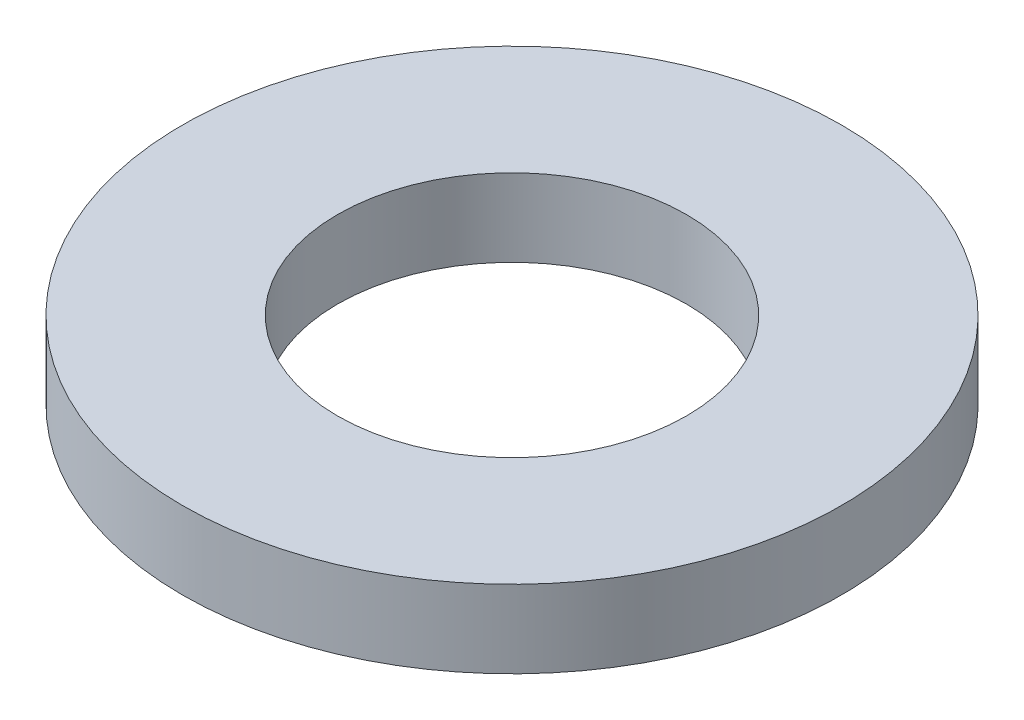
ISO-10303-21;
HEADER;
FILE_DESCRIPTION(('STEP AP214'),'2;1');
FILE_NAME('part.step','',(''),(''),'','','');
FILE_SCHEMA(('AUTOMOTIVE_DESIGN { 1 0 10303 214 1 1 1 1 }'));
ENDSEC;
DATA;
#1=APPLICATION_CONTEXT('core data for automotive mechanical design processes');
#2=APPLICATION_PROTOCOL_DEFINITION('international standard','automotive_design',2000,#1);
#3=PRODUCT_CONTEXT('',#1,'mechanical');
#4=PRODUCT('Part','Part','',(#3));
#5=PRODUCT_RELATED_PRODUCT_CATEGORY('part','',(#4));
#6=PRODUCT_DEFINITION_FORMATION('','',#4);
#7=PRODUCT_DEFINITION_CONTEXT('part definition',#1,'design');
#8=PRODUCT_DEFINITION('design','',#6,#7);
#9=PRODUCT_DEFINITION_SHAPE('','',#8);
#10=(LENGTH_UNIT() NAMED_UNIT(*) SI_UNIT(.MILLI.,.METRE.));
#11=(NAMED_UNIT(*) PLANE_ANGLE_UNIT() SI_UNIT($,.RADIAN.));
#12=(NAMED_UNIT(*) SI_UNIT($,.STERADIAN.) SOLID_ANGLE_UNIT());
#13=UNCERTAINTY_MEASURE_WITH_UNIT(LENGTH_MEASURE(1.E-05),#10,'distance_accuracy_value','');
#14=(GEOMETRIC_REPRESENTATION_CONTEXT(3) GLOBAL_UNCERTAINTY_ASSIGNED_CONTEXT((#13)) GLOBAL_UNIT_ASSIGNED_CONTEXT((#10,
#11,#12)) REPRESENTATION_CONTEXT('',''));
#15=CARTESIAN_POINT('',(0.,0.,0.));
#16=DIRECTION('',(0.,0.,1.));
#17=DIRECTION('',(1.,0.,0.));
#18=AXIS2_PLACEMENT_3D('',#15,#16,#17);
#19=CARTESIAN_POINT('',(0.,12.7,0.));
#20=DIRECTION('',(0.,1.,0.));
#21=DIRECTION('',(0.,0.,1.));
#22=AXIS2_PLACEMENT_3D('',#19,#20,#21);
#23=PLANE('',#22);
#24=CARTESIAN_POINT('',(0.,12.7,0.));
#25=DIRECTION('',(0.,1.,0.));
#26=DIRECTION('',(0.,0.,1.));
#27=AXIS2_PLACEMENT_3D('',#24,#25,#26);
#28=CIRCLE('',#27,53.975);
#29=CARTESIAN_POINT('',(0.,12.7,53.975));
#30=VERTEX_POINT('',#29);
#31=EDGE_CURVE('E10',#30,#30,#28,.T.);
#32=ORIENTED_EDGE('',*,*,#31,.T.);
#33=EDGE_LOOP('',(#32));
#34=FACE_BOUND('',#33,.T.);
#35=CARTESIAN_POINT('',(0.,12.7,0.));
#36=DIRECTION('',(0.,1.,0.));
#37=DIRECTION('',(0.,0.,1.));
#38=AXIS2_PLACEMENT_3D('',#35,#36,#37);
#39=CIRCLE('',#38,28.575);
#40=CARTESIAN_POINT('',(0.,12.7,28.575));
#41=VERTEX_POINT('',#40);
#42=EDGE_CURVE('E43',#41,#41,#39,.T.);
#43=ORIENTED_EDGE('',*,*,#42,.F.);
#44=EDGE_LOOP('',(#43));
#45=FACE_BOUND('',#44,.T.);
#46=ADVANCED_FACE('F32',(#34,#45),#23,.T.);
#47=CARTESIAN_POINT('',(0.,0.,0.));
#48=DIRECTION('',(0.,1.,0.));
#49=DIRECTION('',(0.,0.,1.));
#50=AXIS2_PLACEMENT_3D('',#47,#48,#49);
#51=PLANE('',#50);
#52=CARTESIAN_POINT('',(0.,0.,0.));
#53=DIRECTION('',(0.,1.,0.));
#54=DIRECTION('',(0.,0.,1.));
#55=AXIS2_PLACEMENT_3D('',#52,#53,#54);
#56=CIRCLE('',#55,53.975);
#57=CARTESIAN_POINT('',(0.,0.,53.975));
#58=VERTEX_POINT('',#57);
#59=EDGE_CURVE('E36',#58,#58,#56,.T.);
#60=ORIENTED_EDGE('',*,*,#59,.F.);
#61=EDGE_LOOP('',(#60));
#62=FACE_BOUND('',#61,.T.);
#63=CARTESIAN_POINT('',(0.,0.,0.));
#64=DIRECTION('',(0.,1.,0.));
#65=DIRECTION('',(0.,0.,1.));
#66=AXIS2_PLACEMENT_3D('',#63,#64,#65);
#67=CIRCLE('',#66,28.575);
#68=CARTESIAN_POINT('',(0.,0.,28.575));
#69=VERTEX_POINT('',#68);
#70=EDGE_CURVE('E45',#69,#69,#67,.T.);
#71=ORIENTED_EDGE('',*,*,#70,.T.);
#72=EDGE_LOOP('',(#71));
#73=FACE_BOUND('',#72,.T.);
#74=ADVANCED_FACE('F55',(#62,#73),#51,.F.);
#75=CARTESIAN_POINT('',(0.,12.7,0.));
#76=DIRECTION('',(0.,-1.,0.));
#77=DIRECTION('',(0.,0.,-1.));
#78=AXIS2_PLACEMENT_3D('',#75,#76,#77);
#79=CYLINDRICAL_SURFACE('',#78,53.975);
#80=ORIENTED_EDGE('',*,*,#31,.F.);
#81=EDGE_LOOP('',(#80));
#82=FACE_BOUND('',#81,.T.);
#83=ORIENTED_EDGE('',*,*,#59,.T.);
#84=EDGE_LOOP('',(#83));
#85=FACE_BOUND('',#84,.T.);
#86=ADVANCED_FACE('F34',(#82,#85),#79,.T.);
#87=CARTESIAN_POINT('',(0.,12.7,0.));
#88=DIRECTION('',(0.,-1.,0.));
#89=DIRECTION('',(0.,0.,-1.));
#90=AXIS2_PLACEMENT_3D('',#87,#88,#89);
#91=CYLINDRICAL_SURFACE('',#90,28.575);
#92=ORIENTED_EDGE('',*,*,#42,.T.);
#93=EDGE_LOOP('',(#92));
#94=FACE_BOUND('',#93,.T.);
#95=ORIENTED_EDGE('',*,*,#70,.F.);
#96=EDGE_LOOP('',(#95));
#97=FACE_BOUND('',#96,.T.);
#98=ADVANCED_FACE('F51',(#94,#97),#91,.F.);
#99=CLOSED_SHELL('',(#46,#74,#86,#98));
#100=MANIFOLD_SOLID_BREP('B2',#99);
#101=ADVANCED_BREP_SHAPE_REPRESENTATION('',(#18,#100),#14);
#102=SHAPE_DEFINITION_REPRESENTATION(#9,#101);
ENDSEC;
END-ISO-10303-21;
